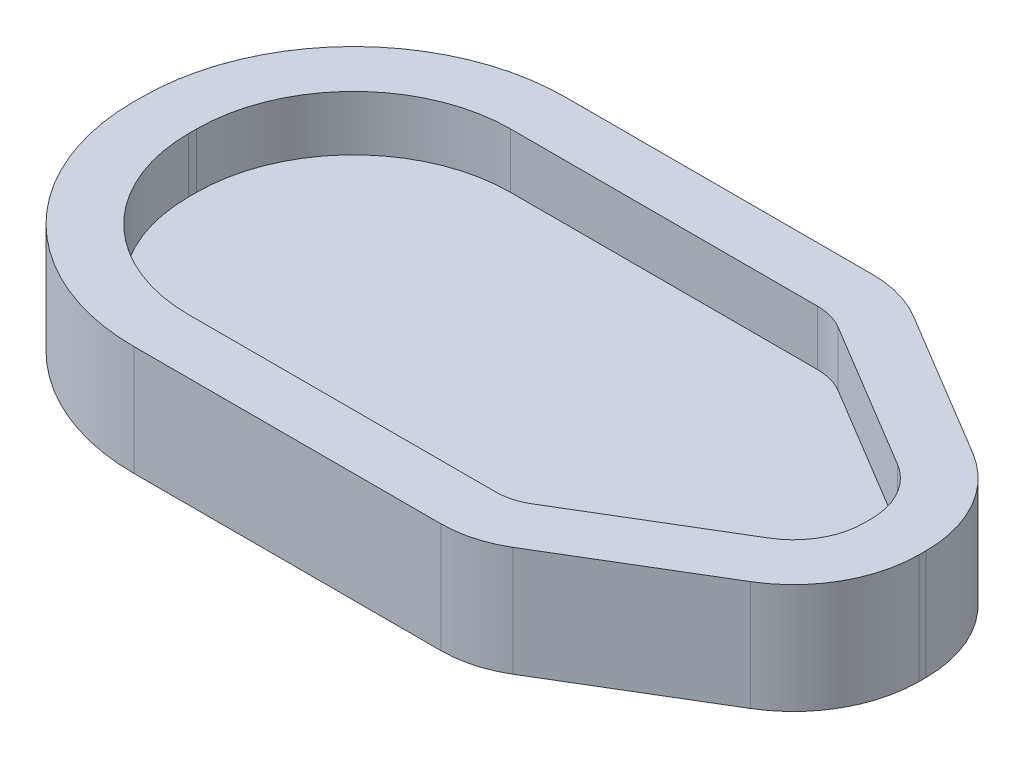
ISO-10303-21;
HEADER;
FILE_DESCRIPTION(('STEP AP214'),'2;1');
FILE_NAME('part.step','',(''),(''),'','','');
FILE_SCHEMA(('AUTOMOTIVE_DESIGN { 1 0 10303 214 1 1 1 1 }'));
ENDSEC;
DATA;
#1=APPLICATION_CONTEXT('core data for automotive mechanical design processes');
#2=APPLICATION_PROTOCOL_DEFINITION('international standard','automotive_design',2000,#1);
#3=PRODUCT_CONTEXT('',#1,'mechanical');
#4=PRODUCT('Part','Part','',(#3));
#5=PRODUCT_RELATED_PRODUCT_CATEGORY('part','',(#4));
#6=PRODUCT_DEFINITION_FORMATION('','',#4);
#7=PRODUCT_DEFINITION_CONTEXT('part definition',#1,'design');
#8=PRODUCT_DEFINITION('design','',#6,#7);
#9=PRODUCT_DEFINITION_SHAPE('','',#8);
#10=(LENGTH_UNIT() NAMED_UNIT(*) SI_UNIT(.MILLI.,.METRE.));
#11=(NAMED_UNIT(*) PLANE_ANGLE_UNIT() SI_UNIT($,.RADIAN.));
#12=(NAMED_UNIT(*) SI_UNIT($,.STERADIAN.) SOLID_ANGLE_UNIT());
#13=UNCERTAINTY_MEASURE_WITH_UNIT(LENGTH_MEASURE(1.E-05),#10,'distance_accuracy_value','');
#14=(GEOMETRIC_REPRESENTATION_CONTEXT(3) GLOBAL_UNCERTAINTY_ASSIGNED_CONTEXT((#13)) GLOBAL_UNIT_ASSIGNED_CONTEXT((#10,
#11,#12)) REPRESENTATION_CONTEXT('',''));
#15=CARTESIAN_POINT('',(0.,0.,0.));
#16=DIRECTION('',(0.,0.,1.));
#17=DIRECTION('',(1.,0.,0.));
#18=AXIS2_PLACEMENT_3D('',#15,#16,#17);
#19=CARTESIAN_POINT('',(25.,7.,13.75));
#20=DIRECTION('',(-1.,0.,0.));
#21=DIRECTION('',(0.,0.,1.));
#22=AXIS2_PLACEMENT_3D('',#19,#20,#21);
#23=PLANE('',#22);
#24=DIRECTION('',(0.,0.,-1.));
#25=VECTOR('',#24,1.);
#26=CARTESIAN_POINT('',(25.,7.,13.75));
#27=LINE('',#26,#25);
#28=CARTESIAN_POINT('',(25.,7.,0.220476968247523));
#29=VERTEX_POINT('',#28);
#30=CARTESIAN_POINT('',(25.,7.,-0.220476968247525));
#31=VERTEX_POINT('',#30);
#32=EDGE_CURVE('E328',#29,#31,#27,.T.);
#33=ORIENTED_EDGE('',*,*,#32,.F.);
#34=DIRECTION('',(0.,1.,0.));
#35=VECTOR('',#34,1.);
#36=CARTESIAN_POINT('',(25.,7.,0.220476968247523));
#37=LINE('',#36,#35);
#38=CARTESIAN_POINT('',(25.,0.,0.220476968247523));
#39=VERTEX_POINT('',#38);
#40=EDGE_CURVE('E400',#29,#39,#37,.F.);
#41=ORIENTED_EDGE('',*,*,#40,.T.);
#42=DIRECTION('',(0.,0.,-1.));
#43=VECTOR('',#42,1.);
#44=CARTESIAN_POINT('',(25.,0.,13.75));
#45=LINE('',#44,#43);
#46=CARTESIAN_POINT('',(25.,0.,-0.220476968247525));
#47=VERTEX_POINT('',#46);
#48=EDGE_CURVE('E321',#39,#47,#45,.T.);
#49=ORIENTED_EDGE('',*,*,#48,.T.);
#50=DIRECTION('',(0.,1.,0.));
#51=VECTOR('',#50,1.);
#52=CARTESIAN_POINT('',(25.,7.,-0.220476968247525));
#53=LINE('',#52,#51);
#54=EDGE_CURVE('E396',#47,#31,#53,.T.);
#55=ORIENTED_EDGE('',*,*,#54,.T.);
#56=EDGE_LOOP('',(#33,#41,#49,#55));
#57=FACE_BOUND('',#56,.T.);
#58=ADVANCED_FACE('F38',(#57),#23,.F.);
#59=CARTESIAN_POINT('',(-25.,7.,-13.75));
#60=DIRECTION('',(0.,0.,1.));
#61=DIRECTION('',(1.,0.,0.));
#62=AXIS2_PLACEMENT_3D('',#59,#60,#61);
#63=PLANE('',#62);
#64=DIRECTION('',(-1.,0.,0.));
#65=VECTOR('',#64,1.);
#66=CARTESIAN_POINT('',(-25.,7.,-13.75));
#67=LINE('',#66,#65);
#68=CARTESIAN_POINT('',(8.06111224536096,7.,-13.75));
#69=VERTEX_POINT('',#68);
#70=CARTESIAN_POINT('',(-11.5,7.,-13.75));
#71=VERTEX_POINT('',#70);
#72=EDGE_CURVE('E332',#69,#71,#67,.T.);
#73=ORIENTED_EDGE('',*,*,#72,.F.);
#74=DIRECTION('',(0.,1.,0.));
#75=VECTOR('',#74,1.);
#76=CARTESIAN_POINT('',(8.06111224536096,7.,-13.75));
#77=LINE('',#76,#75);
#78=CARTESIAN_POINT('',(8.06111224536096,0.,-13.75));
#79=VERTEX_POINT('',#78);
#80=EDGE_CURVE('E11',#69,#79,#77,.F.);
#81=ORIENTED_EDGE('',*,*,#80,.T.);
#82=DIRECTION('',(-1.,0.,0.));
#83=VECTOR('',#82,1.);
#84=CARTESIAN_POINT('',(-25.,0.,-13.75));
#85=LINE('',#84,#83);
#86=CARTESIAN_POINT('',(-11.5,0.,-13.75));
#87=VERTEX_POINT('',#86);
#88=EDGE_CURVE('E348',#79,#87,#85,.T.);
#89=ORIENTED_EDGE('',*,*,#88,.T.);
#90=DIRECTION('',(0.,-1.,0.));
#91=VECTOR('',#90,1.);
#92=CARTESIAN_POINT('',(-11.5,7.,-13.75));
#93=LINE('',#92,#91);
#94=EDGE_CURVE('E381',#87,#71,#93,.F.);
#95=ORIENTED_EDGE('',*,*,#94,.T.);
#96=EDGE_LOOP('',(#73,#81,#89,#95));
#97=FACE_BOUND('',#96,.T.);
#98=ADVANCED_FACE('F483',(#97),#63,.F.);
#99=CARTESIAN_POINT('',(-25.,7.,13.75));
#100=DIRECTION('',(1.,0.,0.));
#101=DIRECTION('',(0.,0.,-1.));
#102=AXIS2_PLACEMENT_3D('',#99,#100,#101);
#103=PLANE('',#102);
#104=DIRECTION('',(0.,0.,1.));
#105=VECTOR('',#104,1.);
#106=CARTESIAN_POINT('',(-25.,0.,13.75));
#107=LINE('',#106,#105);
#108=CARTESIAN_POINT('',(-25.,0.,-0.25));
#109=VERTEX_POINT('',#108);
#110=CARTESIAN_POINT('',(-25.,0.,0.25));
#111=VERTEX_POINT('',#110);
#112=EDGE_CURVE('E351',#109,#111,#107,.T.);
#113=ORIENTED_EDGE('',*,*,#112,.T.);
#114=DIRECTION('',(0.,-1.,0.));
#115=VECTOR('',#114,1.);
#116=CARTESIAN_POINT('',(-25.,7.,0.25));
#117=LINE('',#116,#115);
#118=CARTESIAN_POINT('',(-25.,7.,0.25));
#119=VERTEX_POINT('',#118);
#120=EDGE_CURVE('E372',#111,#119,#117,.F.);
#121=ORIENTED_EDGE('',*,*,#120,.T.);
#122=DIRECTION('',(0.,0.,1.));
#123=VECTOR('',#122,1.);
#124=CARTESIAN_POINT('',(-25.,7.,13.75));
#125=LINE('',#124,#123);
#126=CARTESIAN_POINT('',(-25.,7.,-0.25));
#127=VERTEX_POINT('',#126);
#128=EDGE_CURVE('E336',#127,#119,#125,.T.);
#129=ORIENTED_EDGE('',*,*,#128,.F.);
#130=DIRECTION('',(0.,-1.,0.));
#131=VECTOR('',#130,1.);
#132=CARTESIAN_POINT('',(-25.,7.,-0.25));
#133=LINE('',#132,#131);
#134=EDGE_CURVE('E368',#127,#109,#133,.T.);
#135=ORIENTED_EDGE('',*,*,#134,.T.);
#136=EDGE_LOOP('',(#113,#121,#129,#135));
#137=FACE_BOUND('',#136,.T.);
#138=ADVANCED_FACE('F474',(#137),#103,.F.);
#139=CARTESIAN_POINT('',(-25.,7.,13.75));
#140=DIRECTION('',(0.,0.,-1.));
#141=DIRECTION('',(-1.,0.,0.));
#142=AXIS2_PLACEMENT_3D('',#139,#140,#141);
#143=PLANE('',#142);
#144=DIRECTION('',(1.,0.,0.));
#145=VECTOR('',#144,1.);
#146=CARTESIAN_POINT('',(-25.,0.,13.75));
#147=LINE('',#146,#145);
#148=CARTESIAN_POINT('',(-11.5,0.,13.75));
#149=VERTEX_POINT('',#148);
#150=CARTESIAN_POINT('',(8.06111224536096,0.,13.75));
#151=VERTEX_POINT('',#150);
#152=EDGE_CURVE('E333',#149,#151,#147,.T.);
#153=ORIENTED_EDGE('',*,*,#152,.T.);
#154=DIRECTION('',(0.,1.,0.));
#155=VECTOR('',#154,1.);
#156=CARTESIAN_POINT('',(8.06111224536096,7.,13.75));
#157=LINE('',#156,#155);
#158=CARTESIAN_POINT('',(8.06111224536096,7.,13.75));
#159=VERTEX_POINT('',#158);
#160=EDGE_CURVE('E413',#151,#159,#157,.T.);
#161=ORIENTED_EDGE('',*,*,#160,.T.);
#162=DIRECTION('',(1.,0.,0.));
#163=VECTOR('',#162,1.);
#164=CARTESIAN_POINT('',(-25.,7.,13.75));
#165=LINE('',#164,#163);
#166=CARTESIAN_POINT('',(-11.5,7.,13.75));
#167=VERTEX_POINT('',#166);
#168=EDGE_CURVE('E340',#167,#159,#165,.T.);
#169=ORIENTED_EDGE('',*,*,#168,.F.);
#170=DIRECTION('',(0.,-1.,0.));
#171=VECTOR('',#170,1.);
#172=CARTESIAN_POINT('',(-11.5,7.,13.75));
#173=LINE('',#172,#171);
#174=EDGE_CURVE('E344',#167,#149,#173,.T.);
#175=ORIENTED_EDGE('',*,*,#174,.T.);
#176=EDGE_LOOP('',(#153,#161,#169,#175));
#177=FACE_BOUND('',#176,.T.);
#178=ADVANCED_FACE('F465',(#177),#143,.F.);
#179=CARTESIAN_POINT('',(0.,7.,0.));
#180=DIRECTION('',(0.,-1.,0.));
#181=DIRECTION('',(0.,0.,-1.));
#182=AXIS2_PLACEMENT_3D('',#179,#180,#181);
#183=PLANE('',#182);
#184=DIRECTION('',(1.,0.,0.));
#185=VECTOR('',#184,1.);
#186=CARTESIAN_POINT('',(0.,7.,10.25));
#187=LINE('',#186,#185);
#188=CARTESIAN_POINT('',(-11.5,7.,10.25));
#189=VERTEX_POINT('',#188);
#190=CARTESIAN_POINT('',(8.06111224536096,7.,10.25));
#191=VERTEX_POINT('',#190);
#192=EDGE_CURVE('E267',#189,#191,#187,.T.);
#193=ORIENTED_EDGE('',*,*,#192,.F.);
#194=CARTESIAN_POINT('',(-11.5,7.,0.25));
#195=DIRECTION('',(0.,-1.,0.));
#196=DIRECTION('',(0.,0.,-1.));
#197=AXIS2_PLACEMENT_3D('',#194,#195,#196);
#198=CIRCLE('',#197,10.);
#199=CARTESIAN_POINT('',(-21.5,7.,0.25));
#200=VERTEX_POINT('',#199);
#201=EDGE_CURVE('E252',#200,#189,#198,.F.);
#202=ORIENTED_EDGE('',*,*,#201,.F.);
#203=DIRECTION('',(0.,0.,1.));
#204=VECTOR('',#203,1.);
#205=CARTESIAN_POINT('',(-21.5,7.,0.));
#206=LINE('',#205,#204);
#207=CARTESIAN_POINT('',(-21.5,7.,-0.25));
#208=VERTEX_POINT('',#207);
#209=EDGE_CURVE('E54',#208,#200,#206,.T.);
#210=ORIENTED_EDGE('',*,*,#209,.F.);
#211=CARTESIAN_POINT('',(-11.5,7.,-0.25));
#212=DIRECTION('',(0.,-1.,0.));
#213=DIRECTION('',(0.,0.,-1.));
#214=AXIS2_PLACEMENT_3D('',#211,#212,#213);
#215=CIRCLE('',#214,10.);
#216=CARTESIAN_POINT('',(-11.5,7.,-10.25));
#217=VERTEX_POINT('',#216);
#218=EDGE_CURVE('E261',#217,#208,#215,.F.);
#219=ORIENTED_EDGE('',*,*,#218,.F.);
#220=DIRECTION('',(-1.,0.,0.));
#221=VECTOR('',#220,1.);
#222=CARTESIAN_POINT('',(0.,7.,-10.25));
#223=LINE('',#222,#221);
#224=CARTESIAN_POINT('',(8.06111224536096,7.,-10.25));
#225=VERTEX_POINT('',#224);
#226=EDGE_CURVE('E285',#225,#217,#223,.T.);
#227=ORIENTED_EDGE('',*,*,#226,.F.);
#228=CARTESIAN_POINT('',(8.06111224536096,7.,-6.75));
#229=DIRECTION('',(0.,-1.,0.));
#230=DIRECTION('',(0.,0.,-1.));
#231=AXIS2_PLACEMENT_3D('',#228,#229,#230);
#232=CIRCLE('',#231,3.5);
#233=CARTESIAN_POINT('',(9.8618473893573,7.,-9.75122523999391));
#234=VERTEX_POINT('',#233);
#235=EDGE_CURVE('E270',#234,#225,#232,.F.);
#236=ORIENTED_EDGE('',*,*,#235,.F.);
#237=DIRECTION('',(0.857492925712544,0.,0.514495755427526));
#238=VECTOR('',#237,1.);
#239=CARTESIAN_POINT('',(8.19926485600365,7.,-10.7487747600061));
#240=LINE('',#239,#238);
#241=CARTESIAN_POINT('',(19.3152308994239,7.,-4.07919513395397));
#242=VERTEX_POINT('',#241);
#243=EDGE_CURVE('E289',#234,#242,#240,.T.);
#244=ORIENTED_EDGE('',*,*,#243,.T.);
#245=CARTESIAN_POINT('',(17.,7.,-0.220476968247525));
#246=DIRECTION('',(0.,-1.,0.));
#247=DIRECTION('',(0.,0.,-1.));
#248=AXIS2_PLACEMENT_3D('',#245,#246,#247);
#249=CIRCLE('',#248,4.5);
#250=CARTESIAN_POINT('',(21.5,7.,-0.220476968247524));
#251=VERTEX_POINT('',#250);
#252=EDGE_CURVE('E278',#251,#242,#249,.F.);
#253=ORIENTED_EDGE('',*,*,#252,.F.);
#254=DIRECTION('',(0.,0.,-1.));
#255=VECTOR('',#254,1.);
#256=CARTESIAN_POINT('',(21.5,7.,0.));
#257=LINE('',#256,#255);
#258=CARTESIAN_POINT('',(21.5,7.,0.220476968247523));
#259=VERTEX_POINT('',#258);
#260=EDGE_CURVE('E282',#259,#251,#257,.T.);
#261=ORIENTED_EDGE('',*,*,#260,.F.);
#262=CARTESIAN_POINT('',(17.,7.,0.220476968247523));
#263=DIRECTION('',(0.,-1.,0.));
#264=DIRECTION('',(0.,0.,-1.));
#265=AXIS2_PLACEMENT_3D('',#262,#263,#264);
#266=CIRCLE('',#265,4.5);
#267=CARTESIAN_POINT('',(19.3152308994239,7.,4.07919513395397));
#268=VERTEX_POINT('',#267);
#269=EDGE_CURVE('E208',#268,#259,#266,.F.);
#270=ORIENTED_EDGE('',*,*,#269,.F.);
#271=DIRECTION('',(-0.857492925712544,0.,0.514495755427526));
#272=VECTOR('',#271,1.);
#273=CARTESIAN_POINT('',(8.19926485600365,7.,10.7487747600061));
#274=LINE('',#273,#272);
#275=CARTESIAN_POINT('',(9.8618473893573,7.,9.7512252399939));
#276=VERTEX_POINT('',#275);
#277=EDGE_CURVE('E308',#268,#276,#274,.T.);
#278=ORIENTED_EDGE('',*,*,#277,.T.);
#279=CARTESIAN_POINT('',(8.06111224536096,7.,6.75));
#280=DIRECTION('',(0.,-1.,0.));
#281=DIRECTION('',(0.,0.,-1.));
#282=AXIS2_PLACEMENT_3D('',#279,#280,#281);
#283=CIRCLE('',#282,3.5);
#284=EDGE_CURVE('E275',#191,#276,#283,.F.);
#285=ORIENTED_EDGE('',*,*,#284,.F.);
#286=EDGE_LOOP('',(#193,#202,#210,#219,#227,#236,#244,#253,#261,#270,#278,#285));
#287=FACE_BOUND('',#286,.T.);
#288=ORIENTED_EDGE('',*,*,#168,.T.);
#289=CARTESIAN_POINT('',(8.06111224536096,7.,6.75));
#290=DIRECTION('',(0.,-1.,0.));
#291=DIRECTION('',(0.,0.,-1.));
#292=AXIS2_PLACEMENT_3D('',#289,#290,#291);
#293=CIRCLE('',#292,7.);
#294=CARTESIAN_POINT('',(11.6625825333536,7.,12.7524504799878));
#295=VERTEX_POINT('',#294);
#296=EDGE_CURVE('E420',#159,#295,#293,.F.);
#297=ORIENTED_EDGE('',*,*,#296,.T.);
#298=DIRECTION('',(-0.857492925712544,0.,0.514495755427526));
#299=VECTOR('',#298,1.);
#300=CARTESIAN_POINT('',(9.99999999999999,7.,13.75));
#301=LINE('',#300,#299);
#302=CARTESIAN_POINT('',(21.1159660434202,7.,7.08042037394788));
#303=VERTEX_POINT('',#302);
#304=EDGE_CURVE('E245',#303,#295,#301,.T.);
#305=ORIENTED_EDGE('',*,*,#304,.F.);
#306=CARTESIAN_POINT('',(17.,7.,0.220476968247523));
#307=DIRECTION('',(0.,-1.,0.));
#308=DIRECTION('',(0.,0.,-1.));
#309=AXIS2_PLACEMENT_3D('',#306,#307,#308);
#310=CIRCLE('',#309,8.);
#311=EDGE_CURVE('E393',#303,#29,#310,.F.);
#312=ORIENTED_EDGE('',*,*,#311,.T.);
#313=ORIENTED_EDGE('',*,*,#32,.T.);
#314=CARTESIAN_POINT('',(17.,7.,-0.220476968247525));
#315=DIRECTION('',(0.,-1.,0.));
#316=DIRECTION('',(0.,0.,-1.));
#317=AXIS2_PLACEMENT_3D('',#314,#315,#316);
#318=CIRCLE('',#317,8.);
#319=CARTESIAN_POINT('',(21.1159660434202,7.,-7.08042037394788));
#320=VERTEX_POINT('',#319);
#321=EDGE_CURVE('E389',#31,#320,#318,.F.);
#322=ORIENTED_EDGE('',*,*,#321,.T.);
#323=DIRECTION('',(0.857492925712544,0.,0.514495755427526));
#324=VECTOR('',#323,1.);
#325=CARTESIAN_POINT('',(9.99999999999999,7.,-13.75));
#326=LINE('',#325,#324);
#327=CARTESIAN_POINT('',(11.6625825333536,7.,-12.7524504799878));
#328=VERTEX_POINT('',#327);
#329=EDGE_CURVE('E314',#328,#320,#326,.T.);
#330=ORIENTED_EDGE('',*,*,#329,.F.);
#331=CARTESIAN_POINT('',(8.06111224536096,7.,-6.75));
#332=DIRECTION('',(0.,-1.,0.));
#333=DIRECTION('',(0.,0.,-1.));
#334=AXIS2_PLACEMENT_3D('',#331,#332,#333);
#335=CIRCLE('',#334,7.);
#336=EDGE_CURVE('E417',#328,#69,#335,.F.);
#337=ORIENTED_EDGE('',*,*,#336,.T.);
#338=ORIENTED_EDGE('',*,*,#72,.T.);
#339=CARTESIAN_POINT('',(-11.5,7.,-0.25));
#340=DIRECTION('',(0.,-1.,0.));
#341=DIRECTION('',(0.,0.,-1.));
#342=AXIS2_PLACEMENT_3D('',#339,#340,#341);
#343=CIRCLE('',#342,13.5);
#344=EDGE_CURVE('E375',#71,#127,#343,.F.);
#345=ORIENTED_EDGE('',*,*,#344,.T.);
#346=ORIENTED_EDGE('',*,*,#128,.T.);
#347=CARTESIAN_POINT('',(-11.5,7.,0.25));
#348=DIRECTION('',(0.,-1.,0.));
#349=DIRECTION('',(0.,0.,-1.));
#350=AXIS2_PLACEMENT_3D('',#347,#348,#349);
#351=CIRCLE('',#350,13.5);
#352=EDGE_CURVE('E378',#119,#167,#351,.F.);
#353=ORIENTED_EDGE('',*,*,#352,.T.);
#354=EDGE_LOOP('',(#288,#297,#305,#312,#313,#322,#330,#337,#338,#345,#346,#353));
#355=FACE_BOUND('',#354,.T.);
#356=ADVANCED_FACE('F438',(#287,#355),#183,.F.);
#357=CARTESIAN_POINT('',(0.,0.,0.));
#358=DIRECTION('',(0.,-1.,0.));
#359=DIRECTION('',(0.,0.,-1.));
#360=AXIS2_PLACEMENT_3D('',#357,#358,#359);
#361=PLANE('',#360);
#362=DIRECTION('',(-0.857492925712544,0.,0.514495755427526));
#363=VECTOR('',#362,1.);
#364=CARTESIAN_POINT('',(9.99999999999999,0.,13.75));
#365=LINE('',#364,#363);
#366=CARTESIAN_POINT('',(21.1159660434202,0.,7.08042037394787));
#367=VERTEX_POINT('',#366);
#368=CARTESIAN_POINT('',(11.6625825333536,0.,12.7524504799878));
#369=VERTEX_POINT('',#368);
#370=EDGE_CURVE('E318',#367,#369,#365,.T.);
#371=ORIENTED_EDGE('',*,*,#370,.T.);
#372=CARTESIAN_POINT('',(8.06111224536096,0.,6.75));
#373=DIRECTION('',(0.,-1.,0.));
#374=DIRECTION('',(0.,0.,-1.));
#375=AXIS2_PLACEMENT_3D('',#372,#373,#374);
#376=CIRCLE('',#375,7.);
#377=EDGE_CURVE('E428',#369,#151,#376,.T.);
#378=ORIENTED_EDGE('',*,*,#377,.T.);
#379=ORIENTED_EDGE('',*,*,#152,.F.);
#380=CARTESIAN_POINT('',(-11.5,0.,0.25));
#381=DIRECTION('',(0.,-1.,0.));
#382=DIRECTION('',(0.,0.,-1.));
#383=AXIS2_PLACEMENT_3D('',#380,#381,#382);
#384=CIRCLE('',#383,13.5);
#385=EDGE_CURVE('E365',#149,#111,#384,.T.);
#386=ORIENTED_EDGE('',*,*,#385,.T.);
#387=ORIENTED_EDGE('',*,*,#112,.F.);
#388=CARTESIAN_POINT('',(-11.5,0.,-0.25));
#389=DIRECTION('',(0.,-1.,0.));
#390=DIRECTION('',(0.,0.,-1.));
#391=AXIS2_PLACEMENT_3D('',#388,#389,#390);
#392=CIRCLE('',#391,13.5);
#393=EDGE_CURVE('E361',#109,#87,#392,.T.);
#394=ORIENTED_EDGE('',*,*,#393,.T.);
#395=ORIENTED_EDGE('',*,*,#88,.F.);
#396=CARTESIAN_POINT('',(8.06111224536096,0.,-6.75));
#397=DIRECTION('',(0.,-1.,0.));
#398=DIRECTION('',(0.,0.,-1.));
#399=AXIS2_PLACEMENT_3D('',#396,#397,#398);
#400=CIRCLE('',#399,7.);
#401=CARTESIAN_POINT('',(11.6625825333536,0.,-12.7524504799878));
#402=VERTEX_POINT('',#401);
#403=EDGE_CURVE('E62',#79,#402,#400,.T.);
#404=ORIENTED_EDGE('',*,*,#403,.T.);
#405=DIRECTION('',(0.857492925712544,0.,0.514495755427526));
#406=VECTOR('',#405,1.);
#407=CARTESIAN_POINT('',(9.99999999999999,0.,-13.75));
#408=LINE('',#407,#406);
#409=CARTESIAN_POINT('',(21.1159660434202,0.,-7.08042037394787));
#410=VERTEX_POINT('',#409);
#411=EDGE_CURVE('E317',#402,#410,#408,.T.);
#412=ORIENTED_EDGE('',*,*,#411,.T.);
#413=CARTESIAN_POINT('',(17.,0.,-0.220476968247525));
#414=DIRECTION('',(0.,-1.,0.));
#415=DIRECTION('',(0.,0.,-1.));
#416=AXIS2_PLACEMENT_3D('',#413,#414,#415);
#417=CIRCLE('',#416,8.);
#418=EDGE_CURVE('E403',#410,#47,#417,.T.);
#419=ORIENTED_EDGE('',*,*,#418,.T.);
#420=ORIENTED_EDGE('',*,*,#48,.F.);
#421=CARTESIAN_POINT('',(17.,0.,0.220476968247523));
#422=DIRECTION('',(0.,-1.,0.));
#423=DIRECTION('',(0.,0.,-1.));
#424=AXIS2_PLACEMENT_3D('',#421,#422,#423);
#425=CIRCLE('',#424,8.);
#426=EDGE_CURVE('E406',#39,#367,#425,.T.);
#427=ORIENTED_EDGE('',*,*,#426,.T.);
#428=EDGE_LOOP('',(#371,#378,#379,#386,#387,#394,#395,#404,#412,#419,#420,#427));
#429=FACE_BOUND('',#428,.T.);
#430=ADVANCED_FACE('F447',(#429),#361,.T.);
#431=CARTESIAN_POINT('',(-11.5,7.,0.25));
#432=DIRECTION('',(0.,-1.,0.));
#433=DIRECTION('',(0.,0.,-1.));
#434=AXIS2_PLACEMENT_3D('',#431,#432,#433);
#435=CYLINDRICAL_SURFACE('',#434,13.5);
#436=ORIENTED_EDGE('',*,*,#352,.F.);
#437=ORIENTED_EDGE('',*,*,#120,.F.);
#438=ORIENTED_EDGE('',*,*,#385,.F.);
#439=ORIENTED_EDGE('',*,*,#174,.F.);
#440=EDGE_LOOP('',(#436,#437,#438,#439));
#441=FACE_BOUND('',#440,.T.);
#442=ADVANCED_FACE('F470',(#441),#435,.T.);
#443=CARTESIAN_POINT('',(-11.5,7.,-0.25));
#444=DIRECTION('',(0.,-1.,0.));
#445=DIRECTION('',(0.,0.,-1.));
#446=AXIS2_PLACEMENT_3D('',#443,#444,#445);
#447=CYLINDRICAL_SURFACE('',#446,13.5);
#448=ORIENTED_EDGE('',*,*,#344,.F.);
#449=ORIENTED_EDGE('',*,*,#94,.F.);
#450=ORIENTED_EDGE('',*,*,#393,.F.);
#451=ORIENTED_EDGE('',*,*,#134,.F.);
#452=EDGE_LOOP('',(#448,#449,#450,#451));
#453=FACE_BOUND('',#452,.T.);
#454=ADVANCED_FACE('F479',(#453),#447,.T.);
#455=CARTESIAN_POINT('',(9.99999999999999,-0.00100000000000013,13.75));
#456=DIRECTION('',(-0.514495755427526,0.,-0.857492925712544));
#457=DIRECTION('',(-0.857492925712544,0.,0.514495755427526));
#458=AXIS2_PLACEMENT_3D('',#455,#456,#457);
#459=PLANE('',#458);
#460=ORIENTED_EDGE('',*,*,#304,.T.);
#461=DIRECTION('',(0.,1.,0.));
#462=VECTOR('',#461,1.);
#463=CARTESIAN_POINT('',(11.6625825333536,-0.00100000000000013,12.7524504799878));
#464=LINE('',#463,#462);
#465=EDGE_CURVE('E423',#295,#369,#464,.F.);
#466=ORIENTED_EDGE('',*,*,#465,.T.);
#467=ORIENTED_EDGE('',*,*,#370,.F.);
#468=DIRECTION('',(0.,1.,0.));
#469=VECTOR('',#468,1.);
#470=CARTESIAN_POINT('',(21.1159660434202,-0.00100000000000013,7.08042037394788));
#471=LINE('',#470,#469);
#472=EDGE_CURVE('E385',#367,#303,#471,.T.);
#473=ORIENTED_EDGE('',*,*,#472,.T.);
#474=EDGE_LOOP('',(#460,#466,#467,#473));
#475=FACE_BOUND('',#474,.T.);
#476=ADVANCED_FACE('F457',(#475),#459,.F.);
#477=CARTESIAN_POINT('',(9.99999999999999,-0.00100000000000013,-13.75));
#478=DIRECTION('',(-0.514495755427526,0.,0.857492925712544));
#479=DIRECTION('',(0.857492925712544,0.,0.514495755427526));
#480=AXIS2_PLACEMENT_3D('',#477,#478,#479);
#481=PLANE('',#480);
#482=ORIENTED_EDGE('',*,*,#411,.F.);
#483=DIRECTION('',(0.,1.,0.));
#484=VECTOR('',#483,1.);
#485=CARTESIAN_POINT('',(11.6625825333536,-0.00100000000000013,-12.7524504799878));
#486=LINE('',#485,#484);
#487=EDGE_CURVE('E47',#402,#328,#486,.T.);
#488=ORIENTED_EDGE('',*,*,#487,.T.);
#489=ORIENTED_EDGE('',*,*,#329,.T.);
#490=DIRECTION('',(0.,1.,0.));
#491=VECTOR('',#490,1.);
#492=CARTESIAN_POINT('',(21.1159660434202,-0.00100000000000013,-7.08042037394788));
#493=LINE('',#492,#491);
#494=EDGE_CURVE('E409',#320,#410,#493,.F.);
#495=ORIENTED_EDGE('',*,*,#494,.T.);
#496=EDGE_LOOP('',(#482,#488,#489,#495));
#497=FACE_BOUND('',#496,.T.);
#498=ADVANCED_FACE('F435',(#497),#481,.F.);
#499=CARTESIAN_POINT('',(17.,-0.00100000000000013,0.220476968247523));
#500=DIRECTION('',(0.,1.,0.));
#501=DIRECTION('',(0.,0.,1.));
#502=AXIS2_PLACEMENT_3D('',#499,#500,#501);
#503=CYLINDRICAL_SURFACE('',#502,8.);
#504=ORIENTED_EDGE('',*,*,#426,.F.);
#505=ORIENTED_EDGE('',*,*,#40,.F.);
#506=ORIENTED_EDGE('',*,*,#311,.F.);
#507=ORIENTED_EDGE('',*,*,#472,.F.);
#508=EDGE_LOOP('',(#504,#505,#506,#507));
#509=FACE_BOUND('',#508,.T.);
#510=ADVANCED_FACE('F452',(#509),#503,.T.);
#511=CARTESIAN_POINT('',(17.,7.,-0.220476968247525));
#512=DIRECTION('',(0.,1.,0.));
#513=DIRECTION('',(0.,0.,1.));
#514=AXIS2_PLACEMENT_3D('',#511,#512,#513);
#515=CYLINDRICAL_SURFACE('',#514,8.);
#516=ORIENTED_EDGE('',*,*,#418,.F.);
#517=ORIENTED_EDGE('',*,*,#494,.F.);
#518=ORIENTED_EDGE('',*,*,#321,.F.);
#519=ORIENTED_EDGE('',*,*,#54,.F.);
#520=EDGE_LOOP('',(#516,#517,#518,#519));
#521=FACE_BOUND('',#520,.T.);
#522=ADVANCED_FACE('F445',(#521),#515,.T.);
#523=CARTESIAN_POINT('',(8.06111224536096,7.,6.75));
#524=DIRECTION('',(0.,1.,0.));
#525=DIRECTION('',(0.,0.,1.));
#526=AXIS2_PLACEMENT_3D('',#523,#524,#525);
#527=CYLINDRICAL_SURFACE('',#526,7.);
#528=ORIENTED_EDGE('',*,*,#377,.F.);
#529=ORIENTED_EDGE('',*,*,#465,.F.);
#530=ORIENTED_EDGE('',*,*,#296,.F.);
#531=ORIENTED_EDGE('',*,*,#160,.F.);
#532=EDGE_LOOP('',(#528,#529,#530,#531));
#533=FACE_BOUND('',#532,.T.);
#534=ADVANCED_FACE('F461',(#533),#527,.T.);
#535=CARTESIAN_POINT('',(8.06111224536096,-0.00100000000000013,-6.75));
#536=DIRECTION('',(0.,1.,0.));
#537=DIRECTION('',(0.,0.,1.));
#538=AXIS2_PLACEMENT_3D('',#535,#536,#537);
#539=CYLINDRICAL_SURFACE('',#538,7.);
#540=ORIENTED_EDGE('',*,*,#403,.F.);
#541=ORIENTED_EDGE('',*,*,#80,.F.);
#542=ORIENTED_EDGE('',*,*,#336,.F.);
#543=ORIENTED_EDGE('',*,*,#487,.F.);
#544=EDGE_LOOP('',(#540,#541,#542,#543));
#545=FACE_BOUND('',#544,.T.);
#546=ADVANCED_FACE('F40',(#545),#539,.T.);
#547=CARTESIAN_POINT('',(21.5,7.,13.75));
#548=DIRECTION('',(-1.,0.,0.));
#549=DIRECTION('',(0.,0.,1.));
#550=AXIS2_PLACEMENT_3D('',#547,#548,#549);
#551=PLANE('',#550);
#552=ORIENTED_EDGE('',*,*,#260,.T.);
#553=DIRECTION('',(0.,1.,0.));
#554=VECTOR('',#553,1.);
#555=CARTESIAN_POINT('',(21.5,7.,-0.220476968247525));
#556=LINE('',#555,#554);
#557=CARTESIAN_POINT('',(21.5,3.5,-0.220476968247525));
#558=VERTEX_POINT('',#557);
#559=EDGE_CURVE('E214',#558,#251,#556,.T.);
#560=ORIENTED_EDGE('',*,*,#559,.F.);
#561=DIRECTION('',(0.,0.,-1.));
#562=VECTOR('',#561,1.);
#563=CARTESIAN_POINT('',(21.5,3.5,0.));
#564=LINE('',#563,#562);
#565=CARTESIAN_POINT('',(21.5,3.5,0.220476968247523));
#566=VERTEX_POINT('',#565);
#567=EDGE_CURVE('E218',#566,#558,#564,.T.);
#568=ORIENTED_EDGE('',*,*,#567,.F.);
#569=DIRECTION('',(0.,1.,0.));
#570=VECTOR('',#569,1.);
#571=CARTESIAN_POINT('',(21.5,7.,0.220476968247523));
#572=LINE('',#571,#570);
#573=EDGE_CURVE('E201',#259,#566,#572,.F.);
#574=ORIENTED_EDGE('',*,*,#573,.F.);
#575=EDGE_LOOP('',(#552,#560,#568,#574));
#576=FACE_BOUND('',#575,.T.);
#577=ADVANCED_FACE('F219',(#576),#551,.T.);
#578=CARTESIAN_POINT('',(-25.,7.,-10.25));
#579=DIRECTION('',(0.,0.,1.));
#580=DIRECTION('',(1.,0.,0.));
#581=AXIS2_PLACEMENT_3D('',#578,#579,#580);
#582=PLANE('',#581);
#583=ORIENTED_EDGE('',*,*,#226,.T.);
#584=DIRECTION('',(0.,1.,0.));
#585=VECTOR('',#584,1.);
#586=CARTESIAN_POINT('',(-11.5,7.,-10.25));
#587=LINE('',#586,#585);
#588=CARTESIAN_POINT('',(-11.5,3.5,-10.25));
#589=VERTEX_POINT('',#588);
#590=EDGE_CURVE('E247',#589,#217,#587,.T.);
#591=ORIENTED_EDGE('',*,*,#590,.F.);
#592=DIRECTION('',(-1.,0.,0.));
#593=VECTOR('',#592,1.);
#594=CARTESIAN_POINT('',(0.,3.5,-10.25));
#595=LINE('',#594,#593);
#596=CARTESIAN_POINT('',(8.06111224536096,3.5,-10.25));
#597=VERTEX_POINT('',#596);
#598=EDGE_CURVE('E223',#597,#589,#595,.T.);
#599=ORIENTED_EDGE('',*,*,#598,.F.);
#600=DIRECTION('',(0.,1.,0.));
#601=VECTOR('',#600,1.);
#602=CARTESIAN_POINT('',(8.06111224536096,7.,-10.25));
#603=LINE('',#602,#601);
#604=EDGE_CURVE('E242',#225,#597,#603,.F.);
#605=ORIENTED_EDGE('',*,*,#604,.F.);
#606=EDGE_LOOP('',(#583,#591,#599,#605));
#607=FACE_BOUND('',#606,.T.);
#608=ADVANCED_FACE('F508',(#607),#582,.T.);
#609=CARTESIAN_POINT('',(-21.5,7.,13.75));
#610=DIRECTION('',(1.,0.,0.));
#611=DIRECTION('',(0.,0.,-1.));
#612=AXIS2_PLACEMENT_3D('',#609,#610,#611);
#613=PLANE('',#612);
#614=DIRECTION('',(0.,0.,1.));
#615=VECTOR('',#614,1.);
#616=CARTESIAN_POINT('',(-21.5,3.5,0.));
#617=LINE('',#616,#615);
#618=CARTESIAN_POINT('',(-21.5,3.5,-0.25));
#619=VERTEX_POINT('',#618);
#620=CARTESIAN_POINT('',(-21.5,3.5,0.25));
#621=VERTEX_POINT('',#620);
#622=EDGE_CURVE('E727',#619,#621,#617,.T.);
#623=ORIENTED_EDGE('',*,*,#622,.F.);
#624=DIRECTION('',(0.,1.,0.));
#625=VECTOR('',#624,1.);
#626=CARTESIAN_POINT('',(-21.5,7.,-0.25));
#627=LINE('',#626,#625);
#628=EDGE_CURVE('E253',#208,#619,#627,.F.);
#629=ORIENTED_EDGE('',*,*,#628,.F.);
#630=ORIENTED_EDGE('',*,*,#209,.T.);
#631=DIRECTION('',(0.,1.,0.));
#632=VECTOR('',#631,1.);
#633=CARTESIAN_POINT('',(-21.5,7.,0.25));
#634=LINE('',#633,#632);
#635=EDGE_CURVE('E257',#621,#200,#634,.T.);
#636=ORIENTED_EDGE('',*,*,#635,.F.);
#637=EDGE_LOOP('',(#623,#629,#630,#636));
#638=FACE_BOUND('',#637,.T.);
#639=ADVANCED_FACE('F513',(#638),#613,.T.);
#640=CARTESIAN_POINT('',(-25.,7.,10.25));
#641=DIRECTION('',(0.,0.,-1.));
#642=DIRECTION('',(-1.,0.,0.));
#643=AXIS2_PLACEMENT_3D('',#640,#641,#642);
#644=PLANE('',#643);
#645=DIRECTION('',(1.,0.,0.));
#646=VECTOR('',#645,1.);
#647=CARTESIAN_POINT('',(0.,3.5,10.25));
#648=LINE('',#647,#646);
#649=CARTESIAN_POINT('',(-11.5,3.5,10.25));
#650=VERTEX_POINT('',#649);
#651=CARTESIAN_POINT('',(8.06111224536096,3.5,10.25));
#652=VERTEX_POINT('',#651);
#653=EDGE_CURVE('E286',#650,#652,#648,.T.);
#654=ORIENTED_EDGE('',*,*,#653,.F.);
#655=DIRECTION('',(0.,1.,0.));
#656=VECTOR('',#655,1.);
#657=CARTESIAN_POINT('',(-11.5,7.,10.25));
#658=LINE('',#657,#656);
#659=EDGE_CURVE('E262',#189,#650,#658,.F.);
#660=ORIENTED_EDGE('',*,*,#659,.F.);
#661=ORIENTED_EDGE('',*,*,#192,.T.);
#662=DIRECTION('',(0.,1.,0.));
#663=VECTOR('',#662,1.);
#664=CARTESIAN_POINT('',(8.06111224536096,7.,10.25));
#665=LINE('',#664,#663);
#666=EDGE_CURVE('E237',#652,#191,#665,.T.);
#667=ORIENTED_EDGE('',*,*,#666,.F.);
#668=EDGE_LOOP('',(#654,#660,#661,#667));
#669=FACE_BOUND('',#668,.T.);
#670=ADVANCED_FACE('F519',(#669),#644,.T.);
#671=CARTESIAN_POINT('',(0.,3.5,0.));
#672=DIRECTION('',(0.,-1.,0.));
#673=DIRECTION('',(0.,0.,-1.));
#674=AXIS2_PLACEMENT_3D('',#671,#672,#673);
#675=PLANE('',#674);
#676=DIRECTION('',(-0.857492925712544,0.,0.514495755427526));
#677=VECTOR('',#676,1.);
#678=CARTESIAN_POINT('',(8.19926485600365,3.5,10.7487747600061));
#679=LINE('',#678,#677);
#680=CARTESIAN_POINT('',(19.3152308994239,3.5,4.07919513395397));
#681=VERTEX_POINT('',#680);
#682=CARTESIAN_POINT('',(9.8618473893573,3.5,9.7512252399939));
#683=VERTEX_POINT('',#682);
#684=EDGE_CURVE('E229',#681,#683,#679,.T.);
#685=ORIENTED_EDGE('',*,*,#684,.F.);
#686=CARTESIAN_POINT('',(17.,3.5,0.220476968247523));
#687=DIRECTION('',(0.,-1.,0.));
#688=DIRECTION('',(0.,0.,-1.));
#689=AXIS2_PLACEMENT_3D('',#686,#687,#688);
#690=CIRCLE('',#689,4.5);
#691=EDGE_CURVE('E205',#566,#681,#690,.T.);
#692=ORIENTED_EDGE('',*,*,#691,.F.);
#693=ORIENTED_EDGE('',*,*,#567,.T.);
#694=CARTESIAN_POINT('',(17.,3.5,-0.220476968247525));
#695=DIRECTION('',(0.,-1.,0.));
#696=DIRECTION('',(0.,0.,-1.));
#697=AXIS2_PLACEMENT_3D('',#694,#695,#696);
#698=CIRCLE('',#697,4.5);
#699=CARTESIAN_POINT('',(19.3152308994239,3.5,-4.07919513395397));
#700=VERTEX_POINT('',#699);
#701=EDGE_CURVE('E213',#700,#558,#698,.T.);
#702=ORIENTED_EDGE('',*,*,#701,.F.);
#703=DIRECTION('',(0.857492925712544,0.,0.514495755427526));
#704=VECTOR('',#703,1.);
#705=CARTESIAN_POINT('',(8.19926485600365,3.5,-10.7487747600061));
#706=LINE('',#705,#704);
#707=CARTESIAN_POINT('',(9.8618473893573,3.5,-9.7512252399939));
#708=VERTEX_POINT('',#707);
#709=EDGE_CURVE('E224',#708,#700,#706,.T.);
#710=ORIENTED_EDGE('',*,*,#709,.F.);
#711=CARTESIAN_POINT('',(8.06111224536096,3.5,-6.75));
#712=DIRECTION('',(0.,-1.,0.));
#713=DIRECTION('',(0.,0.,-1.));
#714=AXIS2_PLACEMENT_3D('',#711,#712,#713);
#715=CIRCLE('',#714,3.5);
#716=EDGE_CURVE('E274',#597,#708,#715,.T.);
#717=ORIENTED_EDGE('',*,*,#716,.F.);
#718=ORIENTED_EDGE('',*,*,#598,.T.);
#719=CARTESIAN_POINT('',(-11.5,3.5,-0.25));
#720=DIRECTION('',(0.,-1.,0.));
#721=DIRECTION('',(0.,0.,-1.));
#722=AXIS2_PLACEMENT_3D('',#719,#720,#721);
#723=CIRCLE('',#722,10.);
#724=EDGE_CURVE('E266',#619,#589,#723,.T.);
#725=ORIENTED_EDGE('',*,*,#724,.F.);
#726=ORIENTED_EDGE('',*,*,#622,.T.);
#727=CARTESIAN_POINT('',(-11.5,3.5,0.25));
#728=DIRECTION('',(0.,-1.,0.));
#729=DIRECTION('',(0.,0.,-1.));
#730=AXIS2_PLACEMENT_3D('',#727,#728,#729);
#731=CIRCLE('',#730,10.);
#732=EDGE_CURVE('E258',#650,#621,#731,.T.);
#733=ORIENTED_EDGE('',*,*,#732,.F.);
#734=ORIENTED_EDGE('',*,*,#653,.T.);
#735=CARTESIAN_POINT('',(8.06111224536096,3.5,6.75));
#736=DIRECTION('',(0.,-1.,0.));
#737=DIRECTION('',(0.,0.,-1.));
#738=AXIS2_PLACEMENT_3D('',#735,#736,#737);
#739=CIRCLE('',#738,3.5);
#740=EDGE_CURVE('E280',#683,#652,#739,.T.);
#741=ORIENTED_EDGE('',*,*,#740,.F.);
#742=EDGE_LOOP('',(#685,#692,#693,#702,#710,#717,#718,#725,#726,#733,#734,#741));
#743=FACE_BOUND('',#742,.T.);
#744=ADVANCED_FACE('F226',(#743),#675,.F.);
#745=CARTESIAN_POINT('',(-11.5,7.,0.25));
#746=DIRECTION('',(0.,-1.,0.));
#747=DIRECTION('',(0.,0.,-1.));
#748=AXIS2_PLACEMENT_3D('',#745,#746,#747);
#749=CYLINDRICAL_SURFACE('',#748,10.);
#750=ORIENTED_EDGE('',*,*,#201,.T.);
#751=ORIENTED_EDGE('',*,*,#659,.T.);
#752=ORIENTED_EDGE('',*,*,#732,.T.);
#753=ORIENTED_EDGE('',*,*,#635,.T.);
#754=EDGE_LOOP('',(#750,#751,#752,#753));
#755=FACE_BOUND('',#754,.T.);
#756=ADVANCED_FACE('F525',(#755),#749,.F.);
#757=CARTESIAN_POINT('',(-11.5,7.,-0.25));
#758=DIRECTION('',(0.,-1.,0.));
#759=DIRECTION('',(0.,0.,-1.));
#760=AXIS2_PLACEMENT_3D('',#757,#758,#759);
#761=CYLINDRICAL_SURFACE('',#760,10.);
#762=ORIENTED_EDGE('',*,*,#218,.T.);
#763=ORIENTED_EDGE('',*,*,#628,.T.);
#764=ORIENTED_EDGE('',*,*,#724,.T.);
#765=ORIENTED_EDGE('',*,*,#590,.T.);
#766=EDGE_LOOP('',(#762,#763,#764,#765));
#767=FACE_BOUND('',#766,.T.);
#768=ADVANCED_FACE('F528',(#767),#761,.F.);
#769=CARTESIAN_POINT('',(8.19926485600365,-0.00100000000000013,10.7487747600061));
#770=DIRECTION('',(-0.514495755427526,0.,-0.857492925712544));
#771=DIRECTION('',(-0.857492925712544,0.,0.514495755427526));
#772=AXIS2_PLACEMENT_3D('',#769,#770,#771);
#773=PLANE('',#772);
#774=ORIENTED_EDGE('',*,*,#277,.F.);
#775=DIRECTION('',(0.,1.,0.));
#776=VECTOR('',#775,1.);
#777=CARTESIAN_POINT('',(19.3152308994239,-0.00100000000000013,4.07919513395397));
#778=LINE('',#777,#776);
#779=EDGE_CURVE('E251',#681,#268,#778,.T.);
#780=ORIENTED_EDGE('',*,*,#779,.F.);
#781=ORIENTED_EDGE('',*,*,#684,.T.);
#782=DIRECTION('',(0.,1.,0.));
#783=VECTOR('',#782,1.);
#784=CARTESIAN_POINT('',(9.8618473893573,-0.00100000000000013,9.7512252399939));
#785=LINE('',#784,#783);
#786=EDGE_CURVE('E271',#276,#683,#785,.F.);
#787=ORIENTED_EDGE('',*,*,#786,.F.);
#788=EDGE_LOOP('',(#774,#780,#781,#787));
#789=FACE_BOUND('',#788,.T.);
#790=ADVANCED_FACE('F532',(#789),#773,.T.);
#791=CARTESIAN_POINT('',(8.19926485600365,-0.00100000000000013,-10.7487747600061));
#792=DIRECTION('',(-0.514495755427526,0.,0.857492925712544));
#793=DIRECTION('',(0.857492925712544,0.,0.514495755427526));
#794=AXIS2_PLACEMENT_3D('',#791,#792,#793);
#795=PLANE('',#794);
#796=ORIENTED_EDGE('',*,*,#709,.T.);
#797=DIRECTION('',(0.,1.,0.));
#798=VECTOR('',#797,1.);
#799=CARTESIAN_POINT('',(19.3152308994239,-0.00100000000000013,-4.07919513395397));
#800=LINE('',#799,#798);
#801=EDGE_CURVE('E232',#242,#700,#800,.F.);
#802=ORIENTED_EDGE('',*,*,#801,.F.);
#803=ORIENTED_EDGE('',*,*,#243,.F.);
#804=DIRECTION('',(0.,1.,0.));
#805=VECTOR('',#804,1.);
#806=CARTESIAN_POINT('',(9.8618473893573,-0.00100000000000013,-9.7512252399939));
#807=LINE('',#806,#805);
#808=EDGE_CURVE('E246',#708,#234,#807,.T.);
#809=ORIENTED_EDGE('',*,*,#808,.F.);
#810=EDGE_LOOP('',(#796,#802,#803,#809));
#811=FACE_BOUND('',#810,.T.);
#812=ADVANCED_FACE('F536',(#811),#795,.T.);
#813=CARTESIAN_POINT('',(17.,-0.00100000000000013,0.220476968247523));
#814=DIRECTION('',(0.,1.,0.));
#815=DIRECTION('',(0.,0.,1.));
#816=AXIS2_PLACEMENT_3D('',#813,#814,#815);
#817=CYLINDRICAL_SURFACE('',#816,4.5);
#818=ORIENTED_EDGE('',*,*,#691,.T.);
#819=ORIENTED_EDGE('',*,*,#779,.T.);
#820=ORIENTED_EDGE('',*,*,#269,.T.);
#821=ORIENTED_EDGE('',*,*,#573,.T.);
#822=EDGE_LOOP('',(#818,#819,#820,#821));
#823=FACE_BOUND('',#822,.T.);
#824=ADVANCED_FACE('F203',(#823),#817,.F.);
#825=CARTESIAN_POINT('',(17.,7.,-0.220476968247525));
#826=DIRECTION('',(0.,1.,0.));
#827=DIRECTION('',(0.,0.,1.));
#828=AXIS2_PLACEMENT_3D('',#825,#826,#827);
#829=CYLINDRICAL_SURFACE('',#828,4.5);
#830=ORIENTED_EDGE('',*,*,#701,.T.);
#831=ORIENTED_EDGE('',*,*,#559,.T.);
#832=ORIENTED_EDGE('',*,*,#252,.T.);
#833=ORIENTED_EDGE('',*,*,#801,.T.);
#834=EDGE_LOOP('',(#830,#831,#832,#833));
#835=FACE_BOUND('',#834,.T.);
#836=ADVANCED_FACE('F543',(#835),#829,.F.);
#837=CARTESIAN_POINT('',(8.06111224536096,7.,6.75));
#838=DIRECTION('',(0.,1.,0.));
#839=DIRECTION('',(0.,0.,1.));
#840=AXIS2_PLACEMENT_3D('',#837,#838,#839);
#841=CYLINDRICAL_SURFACE('',#840,3.5);
#842=ORIENTED_EDGE('',*,*,#740,.T.);
#843=ORIENTED_EDGE('',*,*,#666,.T.);
#844=ORIENTED_EDGE('',*,*,#284,.T.);
#845=ORIENTED_EDGE('',*,*,#786,.T.);
#846=EDGE_LOOP('',(#842,#843,#844,#845));
#847=FACE_BOUND('',#846,.T.);
#848=ADVANCED_FACE('F546',(#847),#841,.F.);
#849=CARTESIAN_POINT('',(8.06111224536096,-0.00100000000000013,-6.75));
#850=DIRECTION('',(0.,1.,0.));
#851=DIRECTION('',(0.,0.,1.));
#852=AXIS2_PLACEMENT_3D('',#849,#850,#851);
#853=CYLINDRICAL_SURFACE('',#852,3.5);
#854=ORIENTED_EDGE('',*,*,#716,.T.);
#855=ORIENTED_EDGE('',*,*,#808,.T.);
#856=ORIENTED_EDGE('',*,*,#235,.T.);
#857=ORIENTED_EDGE('',*,*,#604,.T.);
#858=EDGE_LOOP('',(#854,#855,#856,#857));
#859=FACE_BOUND('',#858,.T.);
#860=ADVANCED_FACE('F550',(#859),#853,.F.);
#861=CLOSED_SHELL('',(#58,#98,#138,#178,#356,#430,#442,#454,#476,#498,#510,#522,#534,#546,#577,
#608,#639,#670,#744,#756,#768,#790,#812,#824,#836,#848,#860));
#862=MANIFOLD_SOLID_BREP('B2',#861);
#863=ADVANCED_BREP_SHAPE_REPRESENTATION('',(#18,#862),#14);
#864=SHAPE_DEFINITION_REPRESENTATION(#9,#863);
ENDSEC;
END-ISO-10303-21;
